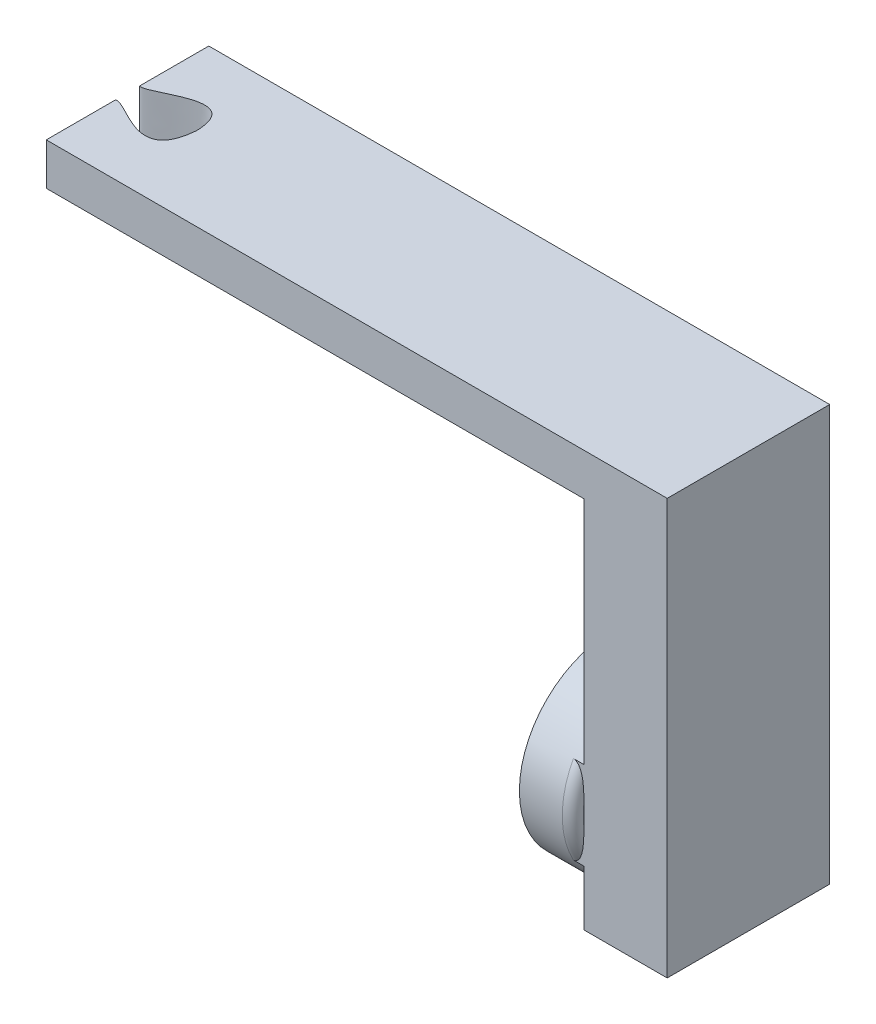
ISO-10303-21;
HEADER;
FILE_DESCRIPTION(('STEP AP214'),'2;1');
FILE_NAME('part.step','',(''),(''),'','','');
FILE_SCHEMA(('AUTOMOTIVE_DESIGN { 1 0 10303 214 1 1 1 1 }'));
ENDSEC;
DATA;
#1=APPLICATION_CONTEXT('core data for automotive mechanical design processes');
#2=APPLICATION_PROTOCOL_DEFINITION('international standard','automotive_design',2000,#1);
#3=PRODUCT_CONTEXT('',#1,'mechanical');
#4=PRODUCT('Part','Part','',(#3));
#5=PRODUCT_RELATED_PRODUCT_CATEGORY('part','',(#4));
#6=PRODUCT_DEFINITION_FORMATION('','',#4);
#7=PRODUCT_DEFINITION_CONTEXT('part definition',#1,'design');
#8=PRODUCT_DEFINITION('design','',#6,#7);
#9=PRODUCT_DEFINITION_SHAPE('','',#8);
#10=(LENGTH_UNIT() NAMED_UNIT(*) SI_UNIT(.MILLI.,.METRE.));
#11=(NAMED_UNIT(*) PLANE_ANGLE_UNIT() SI_UNIT($,.RADIAN.));
#12=(NAMED_UNIT(*) SI_UNIT($,.STERADIAN.) SOLID_ANGLE_UNIT());
#13=UNCERTAINTY_MEASURE_WITH_UNIT(LENGTH_MEASURE(1.E-05),#10,'distance_accuracy_value','');
#14=(GEOMETRIC_REPRESENTATION_CONTEXT(3) GLOBAL_UNCERTAINTY_ASSIGNED_CONTEXT((#13)) GLOBAL_UNIT_ASSIGNED_CONTEXT((#10,
#11,#12)) REPRESENTATION_CONTEXT('',''));
#15=CARTESIAN_POINT('',(0.,0.,0.));
#16=DIRECTION('',(0.,0.,1.));
#17=DIRECTION('',(1.,0.,0.));
#18=AXIS2_PLACEMENT_3D('',#15,#16,#17);
#19=CARTESIAN_POINT('',(127.99867768057,-88.9,-38.6949708390272));
#20=DIRECTION('',(1.,0.,0.));
#21=DIRECTION('',(0.,0.,-1.));
#22=AXIS2_PLACEMENT_3D('',#19,#20,#21);
#23=PLANE('',#22);
#24=CARTESIAN_POINT('',(127.99867768057,-65.278,-19.3474854195136));
#25=DIRECTION('',(1.,0.,0.));
#26=DIRECTION('',(0.,0.,-1.));
#27=AXIS2_PLACEMENT_3D('',#24,#25,#26);
#28=CIRCLE('',#27,22.);
#29=CARTESIAN_POINT('',(127.99867768057,-75.7505740838491,-38.6949708390272));
#30=VERTEX_POINT('',#29);
#31=CARTESIAN_POINT('',(127.99867768057,-75.7505740838491,0.));
#32=VERTEX_POINT('',#31);
#33=EDGE_CURVE('E270',#30,#32,#28,.F.);
#34=ORIENTED_EDGE('',*,*,#33,.F.);
#35=DIRECTION('',(0.,1.,0.));
#36=VECTOR('',#35,1.);
#37=CARTESIAN_POINT('',(127.99867768057,-88.9,-38.6949708390272));
#38=LINE('',#37,#36);
#39=CARTESIAN_POINT('',(127.99867768057,-88.9,-38.6949708390272));
#40=VERTEX_POINT('',#39);
#41=EDGE_CURVE('E180',#40,#30,#38,.T.);
#42=ORIENTED_EDGE('',*,*,#41,.F.);
#43=DIRECTION('',(0.,0.,-1.));
#44=VECTOR('',#43,1.);
#45=CARTESIAN_POINT('',(127.99867768057,-88.9,-38.6949708390272));
#46=LINE('',#45,#44);
#47=CARTESIAN_POINT('',(127.99867768057,-88.9,0.));
#48=VERTEX_POINT('',#47);
#49=EDGE_CURVE('E162',#48,#40,#46,.T.);
#50=ORIENTED_EDGE('',*,*,#49,.F.);
#51=DIRECTION('',(0.,1.,0.));
#52=VECTOR('',#51,1.);
#53=CARTESIAN_POINT('',(127.99867768057,-88.9,0.));
#54=LINE('',#53,#52);
#55=EDGE_CURVE('E159',#48,#32,#54,.T.);
#56=ORIENTED_EDGE('',*,*,#55,.T.);
#57=EDGE_LOOP('',(#34,#42,#50,#56));
#58=FACE_BOUND('',#57,.T.);
#59=ADVANCED_FACE('F33',(#58),#23,.F.);
#60=CARTESIAN_POINT('',(8.4450207177178,0.,-13.0600594295657));
#61=DIRECTION('',(0.,1.,0.));
#62=DIRECTION('',(0.,0.,1.));
#63=AXIS2_PLACEMENT_3D('',#60,#61,#62);
#64=PLANE('',#63);
#65=DIRECTION('',(0.,0.,-1.));
#66=VECTOR('',#65,1.);
#67=CARTESIAN_POINT('',(127.99867768057,0.,-38.6949708390272));
#68=LINE('',#67,#66);
#69=CARTESIAN_POINT('',(127.99867768057,0.,0.));
#70=VERTEX_POINT('',#69);
#71=CARTESIAN_POINT('',(127.99867768057,0.,-38.6949708390272));
#72=VERTEX_POINT('',#71);
#73=EDGE_CURVE('E168',#70,#72,#68,.T.);
#74=ORIENTED_EDGE('',*,*,#73,.F.);
#75=DIRECTION('',(1.,0.,0.));
#76=VECTOR('',#75,1.);
#77=CARTESIAN_POINT('',(0.,0.,0.));
#78=LINE('',#77,#76);
#79=CARTESIAN_POINT('',(0.,0.,0.));
#80=VERTEX_POINT('',#79);
#81=EDGE_CURVE('E385',#80,#70,#78,.T.);
#82=ORIENTED_EDGE('',*,*,#81,.F.);
#83=DIRECTION('',(0.,0.,1.));
#84=VECTOR('',#83,1.);
#85=CARTESIAN_POINT('',(0.,0.,0.));
#86=LINE('',#85,#84);
#87=CARTESIAN_POINT('',(0.,0.,-16.5121344341374));
#88=VERTEX_POINT('',#87);
#89=EDGE_CURVE('E186',#88,#80,#86,.T.);
#90=ORIENTED_EDGE('',*,*,#89,.F.);
#91=CARTESIAN_POINT('',(15.9956701151346,0.,-19.7112346821213));
#92=CARTESIAN_POINT('',(14.8015757870651,0.,-5.45231285430226));
#93=CARTESIAN_POINT('',(2.38658942180415,0.,-17.3000559191201));
#94=CARTESIAN_POINT('',(0.,0.,-16.5121344341374));
#95=B_SPLINE_CURVE_WITH_KNOTS('',3,(#91,#92,#93,#94),.UNSPECIFIED.,.F.,.F.,(4,4),(0.,1.),.UNSPECIFIED.);
#96=CARTESIAN_POINT('',(15.9956701151346,0.,-19.7112346821211));
#97=VERTEX_POINT('',#96);
#98=EDGE_CURVE('E192',#97,#88,#95,.T.);
#99=ORIENTED_EDGE('',*,*,#98,.F.);
#100=CARTESIAN_POINT('',(0.,0.,-22.1828364048899));
#101=CARTESIAN_POINT('',(2.80590377124711,0.,-21.4591789106064));
#102=CARTESIAN_POINT('',(15.7773313591399,0.,-32.7734693197357));
#103=CARTESIAN_POINT('',(15.9956701151346,0.,-19.7112346821211));
#104=B_SPLINE_CURVE_WITH_KNOTS('',3,(#100,#101,#102,#103),.UNSPECIFIED.,.F.,.F.,(4,4),(0.,1.),.UNSPECIFIED.);
#105=CARTESIAN_POINT('',(0.,0.,-22.1828364048899));
#106=VERTEX_POINT('',#105);
#107=EDGE_CURVE('E371',#106,#97,#104,.T.);
#108=ORIENTED_EDGE('',*,*,#107,.F.);
#109=DIRECTION('',(0.,0.,1.));
#110=VECTOR('',#109,1.);
#111=CARTESIAN_POINT('',(0.,0.,-22.1828364048899));
#112=LINE('',#111,#110);
#113=CARTESIAN_POINT('',(0.,0.,-38.6949708390272));
#114=VERTEX_POINT('',#113);
#115=EDGE_CURVE('E378',#114,#106,#112,.T.);
#116=ORIENTED_EDGE('',*,*,#115,.F.);
#117=DIRECTION('',(-1.,0.,0.));
#118=VECTOR('',#117,1.);
#119=CARTESIAN_POINT('',(0.,0.,-38.6949708390272));
#120=LINE('',#119,#118);
#121=EDGE_CURVE('E383',#72,#114,#120,.T.);
#122=ORIENTED_EDGE('',*,*,#121,.F.);
#123=EDGE_LOOP('',(#74,#82,#90,#99,#108,#116,#122));
#124=FACE_BOUND('',#123,.T.);
#125=ADVANCED_FACE('F252',(#124),#64,.F.);
#126=CARTESIAN_POINT('',(0.,10.,0.));
#127=DIRECTION('',(1.,0.,0.));
#128=DIRECTION('',(0.,0.,-1.));
#129=AXIS2_PLACEMENT_3D('',#126,#127,#128);
#130=PLANE('',#129);
#131=ORIENTED_EDGE('',*,*,#89,.T.);
#132=DIRECTION('',(0.,-1.,0.));
#133=VECTOR('',#132,1.);
#134=CARTESIAN_POINT('',(0.,10.,0.));
#135=LINE('',#134,#133);
#136=CARTESIAN_POINT('',(0.,10.,0.));
#137=VERTEX_POINT('',#136);
#138=EDGE_CURVE('E152',#137,#80,#135,.T.);
#139=ORIENTED_EDGE('',*,*,#138,.F.);
#140=DIRECTION('',(0.,0.,1.));
#141=VECTOR('',#140,1.);
#142=CARTESIAN_POINT('',(0.,10.,0.));
#143=LINE('',#142,#141);
#144=CARTESIAN_POINT('',(0.,10.,-16.5121344341374));
#145=VERTEX_POINT('',#144);
#146=EDGE_CURVE('E188',#145,#137,#143,.T.);
#147=ORIENTED_EDGE('',*,*,#146,.F.);
#148=DIRECTION('',(0.,-1.,0.));
#149=VECTOR('',#148,1.);
#150=CARTESIAN_POINT('',(0.,10.,-16.5121344341374));
#151=LINE('',#150,#149);
#152=EDGE_CURVE('E366',#145,#88,#151,.T.);
#153=ORIENTED_EDGE('',*,*,#152,.T.);
#154=EDGE_LOOP('',(#131,#139,#147,#153));
#155=FACE_BOUND('',#154,.T.);
#156=ADVANCED_FACE('F249',(#155),#130,.F.);
#157=CARTESIAN_POINT('',(0.,10.,0.));
#158=DIRECTION('',(0.,0.,-1.));
#159=DIRECTION('',(-1.,0.,0.));
#160=AXIS2_PLACEMENT_3D('',#157,#158,#159);
#161=PLANE('',#160);
#162=ORIENTED_EDGE('',*,*,#81,.T.);
#163=CARTESIAN_POINT('',(127.99867768057,-54.8054259161509,0.));
#164=VERTEX_POINT('',#163);
#165=EDGE_CURVE('E183',#164,#70,#54,.T.);
#166=ORIENTED_EDGE('',*,*,#165,.F.);
#167=DIRECTION('',(1.,0.,0.));
#168=VECTOR('',#167,1.);
#169=CARTESIAN_POINT('',(125.49867768057,-54.8054259161509,0.));
#170=LINE('',#169,#168);
#171=CARTESIAN_POINT('',(125.49867768057,-54.8054259161509,0.));
#172=VERTEX_POINT('',#171);
#173=EDGE_CURVE('E263',#172,#164,#170,.T.);
#174=ORIENTED_EDGE('',*,*,#173,.F.);
#175=CARTESIAN_POINT('',(125.49867768057,-54.8054259161509,0.));
#176=CARTESIAN_POINT('',(125.534549779496,-54.805417877973,0.));
#177=CARTESIAN_POINT('',(125.570401633384,-54.8070492314033,0.));
#178=CARTESIAN_POINT('',(125.641787403858,-54.8135043997957,0.));
#179=CARTESIAN_POINT('',(125.677321561618,-54.8183255393157,0.));
#180=CARTESIAN_POINT('',(125.782447175556,-54.8373265359022,0.));
#181=CARTESIAN_POINT('',(125.851257313316,-54.8560476326537,0.));
#182=CARTESIAN_POINT('',(125.984750554884,-54.9040220293344,0.));
#183=CARTESIAN_POINT('',(126.049445539526,-54.9332432228338,0.));
#184=CARTESIAN_POINT('',(126.174274575371,-55.0003818894811,0.));
#185=CARTESIAN_POINT('',(126.234397250177,-55.0383201663807,0.));
#186=CARTESIAN_POINT('',(126.389855710778,-55.14987851257,0.));
#187=CARTESIAN_POINT('',(126.480552230527,-55.2299469980976,0.));
#188=CARTESIAN_POINT('',(126.648640480711,-55.4029754206652,0.));
#189=CARTESIAN_POINT('',(126.72599442004,-55.4959706698341,0.));
#190=CARTESIAN_POINT('',(126.86114799803,-55.6795819043724,0.));
#191=CARTESIAN_POINT('',(126.920164798004,-55.7693183936313,0.));
#192=CARTESIAN_POINT('',(127.030322147936,-55.9535492774397,0.));
#193=CARTESIAN_POINT('',(127.08145602131,-56.0480476162238,0.));
#194=CARTESIAN_POINT('',(127.176976090986,-56.2405561459892,0.));
#195=CARTESIAN_POINT('',(127.221350853611,-56.3385719485866,0.));
#196=CARTESIAN_POINT('',(127.304163460054,-56.5370145987542,0.));
#197=CARTESIAN_POINT('',(127.342603375989,-56.6374405906059,0.));
#198=CARTESIAN_POINT('',(127.429988363095,-56.8842638253805,0.));
#199=CARTESIAN_POINT('',(127.476211071507,-57.0316223833252,0.));
#200=CARTESIAN_POINT('',(127.55995089425,-57.3288213299456,0.));
#201=CARTESIAN_POINT('',(127.597463626619,-57.4786629273936,0.));
#202=CARTESIAN_POINT('',(127.665277661257,-57.7802208812449,0.));
#203=CARTESIAN_POINT('',(127.695566439824,-57.9319400206206,0.));
#204=CARTESIAN_POINT('',(127.750043276998,-58.236482227046,0.));
#205=CARTESIAN_POINT('',(127.774230201472,-58.3893054938947,0.));
#206=CARTESIAN_POINT('',(127.817620827183,-58.6966557330493,0.));
#207=CARTESIAN_POINT('',(127.836791306427,-58.8511873326564,0.));
#208=CARTESIAN_POINT('',(127.870783919317,-59.1607329632442,0.));
#209=CARTESIAN_POINT('',(127.88560566876,-59.3157470356285,0.));
#210=CARTESIAN_POINT('',(127.92463283494,-59.7809176327666,0.));
#211=CARTESIAN_POINT('',(127.943442454068,-60.0915256191005,0.));
#212=CARTESIAN_POINT('',(127.966607408522,-60.607061966472,0.));
#213=CARTESIAN_POINT('',(127.97370477095,-60.8118884772178,0.));
#214=CARTESIAN_POINT('',(127.984763776684,-61.2216605507734,0.));
#215=CARTESIAN_POINT('',(127.988724918896,-61.4266061273742,0.));
#216=CARTESIAN_POINT('',(127.994415776785,-61.8336338423682,0.));
#217=CARTESIAN_POINT('',(127.996176155567,-62.0357156271891,0.));
#218=CARTESIAN_POINT('',(127.998295433189,-62.439835358555,0.));
#219=CARTESIAN_POINT('',(127.998654692729,-62.6418733029918,0.));
#220=CARTESIAN_POINT('',(127.99867768057,-62.8439071624714,0.));
#221=B_SPLINE_CURVE_WITH_KNOTS('',3,(#175,#176,#177,#178,#179,#180,#181,#182,#183,#184,#185,
#186,#187,#188,#189,#190,#191,#192,#193,#194,#195,#196,#197,#198,#199,#200,#201,#202,#203,#204,
#205,#206,#207,#208,#209,#210,#211,#212,#213,#214,#215,#216,#217,#218,#219,#220),.UNSPECIFIED.,
.F.,.F.,(4,2,2,2,2,2,2,2,2,2,2,2,2,2,2,2,2,2,2,2,2,2,4),(0.,0.107541316419669,0.214992546409573,
0.427837884615498,0.640037862036771,0.852749624299243,1.21361053522845,1.57547732716521,
1.89722051824507,2.21923473570236,2.54178776169803,2.86422791420227,3.32718660942116,
3.79037771550433,4.2543660822567,4.71844062568869,5.18551493179386,5.65263049059046,
6.58588519246199,7.20071732555021,7.81564767460551,8.42191112999402,9.02801850043509),.UNSPECIFIED.);
#222=CARTESIAN_POINT('',(127.99867768057,-62.8439071624714,0.));
#223=VERTEX_POINT('',#222);
#224=EDGE_CURVE('E46',#172,#223,#221,.T.);
#225=ORIENTED_EDGE('',*,*,#224,.T.);
#226=CARTESIAN_POINT('',(127.99867768057,-67.7120928375286,0.));
#227=VERTEX_POINT('',#226);
#228=EDGE_CURVE('E187',#227,#223,#54,.T.);
#229=ORIENTED_EDGE('',*,*,#228,.F.);
#230=CARTESIAN_POINT('',(127.99867768057,-67.7120928375286,0.));
#231=CARTESIAN_POINT('',(127.998651209059,-67.9204313789086,0.));
#232=CARTESIAN_POINT('',(127.998270920503,-68.1287756371866,0.));
#233=CARTESIAN_POINT('',(127.99599711209,-68.5454923464312,0.));
#234=CARTESIAN_POINT('',(127.994103320431,-68.7538647957396,0.));
#235=CARTESIAN_POINT('',(127.987979406295,-69.1717352235252,0.));
#236=CARTESIAN_POINT('',(127.983736386025,-69.3812330356817,0.));
#237=CARTESIAN_POINT('',(127.971888608942,-69.8001252337407,0.));
#238=CARTESIAN_POINT('',(127.964284078401,-70.009519625655,0.));
#239=CARTESIAN_POINT('',(127.944530532892,-70.4280849409009,0.));
#240=CARTESIAN_POINT('',(127.932381907284,-70.6372558818393,0.));
#241=CARTESIAN_POINT('',(127.902141163441,-71.0551640609575,0.));
#242=CARTESIAN_POINT('',(127.884049599969,-71.2639013377895,0.));
#243=CARTESIAN_POINT('',(127.840292928322,-71.6801385686226,0.));
#244=CARTESIAN_POINT('',(127.814644404318,-71.8876402274651,0.));
#245=CARTESIAN_POINT('',(127.753729539051,-72.3012041824015,0.));
#246=CARTESIAN_POINT('',(127.718466774854,-72.5072669846485,0.));
#247=CARTESIAN_POINT('',(127.658097441181,-72.806164890727,0.));
#248=CARTESIAN_POINT('',(127.637809324532,-72.8999760261753,0.));
#249=CARTESIAN_POINT('',(127.59433671634,-73.0869351103727,0.));
#250=CARTESIAN_POINT('',(127.571151771753,-73.1800829529731,0.));
#251=CARTESIAN_POINT('',(127.496494833577,-73.4592299460506,0.));
#252=CARTESIAN_POINT('',(127.440105145168,-73.6439823145834,0.));
#253=CARTESIAN_POINT('',(127.332340932119,-73.9469669071459,0.));
#254=CARTESIAN_POINT('',(127.285566478334,-74.0668335638973,0.));
#255=CARTESIAN_POINT('',(127.183226795521,-74.3029377002968,0.));
#256=CARTESIAN_POINT('',(127.127654273101,-74.4191720722898,0.));
#257=CARTESIAN_POINT('',(127.006522423905,-74.6452773557503,0.));
#258=CARTESIAN_POINT('',(126.941040376585,-74.7551891351495,0.));
#259=CARTESIAN_POINT('',(126.797886835702,-74.966645332729,0.));
#260=CARTESIAN_POINT('',(126.720243490582,-75.0682082672715,0.));
#261=CARTESIAN_POINT('',(126.576086711213,-75.2299427159124,0.));
#262=CARTESIAN_POINT('',(126.513255697102,-75.2933724760663,0.));
#263=CARTESIAN_POINT('',(126.379818914664,-75.4117515901152,0.));
#264=CARTESIAN_POINT('',(126.30920652231,-75.4666936216391,0.));
#265=CARTESIAN_POINT('',(126.159138368199,-75.56553149608,0.));
#266=CARTESIAN_POINT('',(126.079578163253,-75.6092719307558,0.));
#267=CARTESIAN_POINT('',(125.913616628971,-75.6806143507461,0.));
#268=CARTESIAN_POINT('',(125.827244118599,-75.7082805731216,0.));
#269=CARTESIAN_POINT('',(125.699507763388,-75.7342636614574,0.));
#270=CARTESIAN_POINT('',(125.659639053034,-75.7403508400199,0.));
#271=CARTESIAN_POINT('',(125.579417543355,-75.7485150386798,0.));
#272=CARTESIAN_POINT('',(125.539063963836,-75.7505843646454,0.));
#273=CARTESIAN_POINT('',(125.49867768057,-75.7505740838491,0.));
#274=B_SPLINE_CURVE_WITH_KNOTS('',3,(#230,#231,#232,#233,#234,#235,#236,#237,#238,#239,#240,
#241,#242,#243,#244,#245,#246,#247,#248,#249,#250,#251,#252,#253,#254,#255,#256,#257,#258,#259,
#260,#261,#262,#263,#264,#265,#266,#267,#268,#269,#270,#271,#272,#273),.UNSPECIFIED.,.F.,.F.,(4,
2,2,2,2,2,2,2,2,2,2,2,2,2,2,2,2,2,2,2,2,4),(0.,0.625024348670401,1.25016096794978,
1.87876425828468,2.50732524213566,3.13583238015589,3.76428086479374,4.39136032830842,
5.01820679886956,5.30610373031974,5.59404574345396,6.17282879206291,6.55857278058044,
6.94463823250796,7.32783487446257,7.7101573339032,7.97742265220368,8.24491726820648,
8.51594335794394,8.78587876639953,8.90669266793515,9.02773769911569),.UNSPECIFIED.);
#275=CARTESIAN_POINT('',(125.49867768057,-75.7505740838491,0.));
#276=VERTEX_POINT('',#275);
#277=EDGE_CURVE('E11',#227,#276,#274,.T.);
#278=ORIENTED_EDGE('',*,*,#277,.T.);
#279=DIRECTION('',(1.,0.,0.));
#280=VECTOR('',#279,1.);
#281=CARTESIAN_POINT('',(127.99867768057,-75.7505740838491,0.));
#282=LINE('',#281,#280);
#283=EDGE_CURVE('E52',#32,#276,#282,.F.);
#284=ORIENTED_EDGE('',*,*,#283,.F.);
#285=ORIENTED_EDGE('',*,*,#55,.F.);
#286=DIRECTION('',(-1.,0.,0.));
#287=VECTOR('',#286,1.);
#288=CARTESIAN_POINT('',(147.830868252527,-88.9,0.));
#289=LINE('',#288,#287);
#290=CARTESIAN_POINT('',(147.830868252527,-88.9,0.));
#291=VERTEX_POINT('',#290);
#292=EDGE_CURVE('E155',#291,#48,#289,.T.);
#293=ORIENTED_EDGE('',*,*,#292,.F.);
#294=DIRECTION('',(0.,-1.,0.));
#295=VECTOR('',#294,1.);
#296=CARTESIAN_POINT('',(147.830868252527,10.,0.));
#297=LINE('',#296,#295);
#298=CARTESIAN_POINT('',(147.830868252527,10.,0.));
#299=VERTEX_POINT('',#298);
#300=EDGE_CURVE('E145',#299,#291,#297,.T.);
#301=ORIENTED_EDGE('',*,*,#300,.F.);
#302=DIRECTION('',(1.,0.,0.));
#303=VECTOR('',#302,1.);
#304=CARTESIAN_POINT('',(0.,10.,0.));
#305=LINE('',#304,#303);
#306=EDGE_CURVE('E191',#137,#299,#305,.T.);
#307=ORIENTED_EDGE('',*,*,#306,.F.);
#308=ORIENTED_EDGE('',*,*,#138,.T.);
#309=EDGE_LOOP('',(#162,#166,#174,#225,#229,#278,#284,#285,#293,#301,#307,#308));
#310=FACE_BOUND('',#309,.T.);
#311=ADVANCED_FACE('F157',(#310),#161,.F.);
#312=CARTESIAN_POINT('',(147.830868252527,10.,0.));
#313=DIRECTION('',(-1.,0.,0.));
#314=DIRECTION('',(0.,0.,1.));
#315=AXIS2_PLACEMENT_3D('',#312,#313,#314);
#316=PLANE('',#315);
#317=ORIENTED_EDGE('',*,*,#300,.T.);
#318=DIRECTION('',(0.,0.,1.));
#319=VECTOR('',#318,1.);
#320=CARTESIAN_POINT('',(147.830868252527,-88.9,-38.6949708390272));
#321=LINE('',#320,#319);
#322=CARTESIAN_POINT('',(147.830868252527,-88.9,-38.6949708390272));
#323=VERTEX_POINT('',#322);
#324=EDGE_CURVE('E150',#323,#291,#321,.T.);
#325=ORIENTED_EDGE('',*,*,#324,.F.);
#326=DIRECTION('',(0.,-1.,0.));
#327=VECTOR('',#326,1.);
#328=CARTESIAN_POINT('',(147.830868252527,10.,-38.6949708390272));
#329=LINE('',#328,#327);
#330=CARTESIAN_POINT('',(147.830868252527,10.,-38.6949708390272));
#331=VERTEX_POINT('',#330);
#332=EDGE_CURVE('E153',#331,#323,#329,.T.);
#333=ORIENTED_EDGE('',*,*,#332,.F.);
#334=DIRECTION('',(0.,0.,-1.));
#335=VECTOR('',#334,1.);
#336=CARTESIAN_POINT('',(147.830868252527,10.,0.));
#337=LINE('',#336,#335);
#338=EDGE_CURVE('E151',#299,#331,#337,.T.);
#339=ORIENTED_EDGE('',*,*,#338,.F.);
#340=EDGE_LOOP('',(#317,#325,#333,#339));
#341=FACE_BOUND('',#340,.T.);
#342=ADVANCED_FACE('F147',(#341),#316,.F.);
#343=CARTESIAN_POINT('',(0.,10.,-38.6949708390272));
#344=DIRECTION('',(0.,0.,1.));
#345=DIRECTION('',(1.,0.,0.));
#346=AXIS2_PLACEMENT_3D('',#343,#344,#345);
#347=PLANE('',#346);
#348=ORIENTED_EDGE('',*,*,#332,.T.);
#349=DIRECTION('',(1.,0.,0.));
#350=VECTOR('',#349,1.);
#351=CARTESIAN_POINT('',(147.830868252527,-88.9,-38.6949708390272));
#352=LINE('',#351,#350);
#353=EDGE_CURVE('E167',#40,#323,#352,.T.);
#354=ORIENTED_EDGE('',*,*,#353,.F.);
#355=ORIENTED_EDGE('',*,*,#41,.T.);
#356=DIRECTION('',(1.,0.,0.));
#357=VECTOR('',#356,1.);
#358=CARTESIAN_POINT('',(125.49867768057,-75.7505740838491,-38.6949708390272));
#359=LINE('',#358,#357);
#360=CARTESIAN_POINT('',(125.49867768057,-75.7505740838491,-38.6949708390272));
#361=VERTEX_POINT('',#360);
#362=EDGE_CURVE('E343',#361,#30,#359,.T.);
#363=ORIENTED_EDGE('',*,*,#362,.F.);
#364=CARTESIAN_POINT('',(125.49867768057,-75.7505740838491,-38.6949708390272));
#365=CARTESIAN_POINT('',(125.534549779496,-75.750582122027,-38.6949708390272));
#366=CARTESIAN_POINT('',(125.570401633384,-75.7489507685967,-38.6949708390272));
#367=CARTESIAN_POINT('',(125.641787403858,-75.7424956002043,-38.6949708390272));
#368=CARTESIAN_POINT('',(125.677321561618,-75.7376744606843,-38.6949708390272));
#369=CARTESIAN_POINT('',(125.782447175556,-75.7186734640978,-38.6949708390272));
#370=CARTESIAN_POINT('',(125.851257313316,-75.6999523673463,-38.6949708390272));
#371=CARTESIAN_POINT('',(125.984750554884,-75.6519779706656,-38.6949708390272));
#372=CARTESIAN_POINT('',(126.049445539526,-75.6227567771662,-38.6949708390272));
#373=CARTESIAN_POINT('',(126.174274575371,-75.5556181105189,-38.6949708390272));
#374=CARTESIAN_POINT('',(126.234397250177,-75.5176798336192,-38.6949708390272));
#375=CARTESIAN_POINT('',(126.389855710778,-75.40612148743,-38.6949708390272));
#376=CARTESIAN_POINT('',(126.480552230527,-75.3260530019024,-38.6949708390272));
#377=CARTESIAN_POINT('',(126.648640480711,-75.1530245793347,-38.6949708390272));
#378=CARTESIAN_POINT('',(126.72599442004,-75.0600293301659,-38.6949708390272));
#379=CARTESIAN_POINT('',(126.86114799803,-74.8764180956275,-38.6949708390272));
#380=CARTESIAN_POINT('',(126.920164798004,-74.7866816063686,-38.6949708390272));
#381=CARTESIAN_POINT('',(127.030322147936,-74.6024507225602,-38.6949708390272));
#382=CARTESIAN_POINT('',(127.08145602131,-74.5079523837762,-38.6949708390272));
#383=CARTESIAN_POINT('',(127.176976090986,-74.3154438540108,-38.6949708390272));
#384=CARTESIAN_POINT('',(127.221350853611,-74.2174280514134,-38.6949708390272));
#385=CARTESIAN_POINT('',(127.304163460054,-74.0189854012458,-38.6949708390272));
#386=CARTESIAN_POINT('',(127.342603375989,-73.918559409394,-38.6949708390272));
#387=CARTESIAN_POINT('',(127.429988363095,-73.6717361746194,-38.6949708390272));
#388=CARTESIAN_POINT('',(127.476211071507,-73.5243776166747,-38.6949708390272));
#389=CARTESIAN_POINT('',(127.55995089425,-73.2271786700544,-38.6949708390272));
#390=CARTESIAN_POINT('',(127.597463626619,-73.0773370726064,-38.6949708390272));
#391=CARTESIAN_POINT('',(127.665277661257,-72.775779118755,-38.6949708390272));
#392=CARTESIAN_POINT('',(127.695566439824,-72.6240599793793,-38.6949708390272));
#393=CARTESIAN_POINT('',(127.750043276998,-72.319517772954,-38.6949708390272));
#394=CARTESIAN_POINT('',(127.774230201472,-72.1666945061052,-38.6949708390272));
#395=CARTESIAN_POINT('',(127.817620827183,-71.8593442669506,-38.6949708390272));
#396=CARTESIAN_POINT('',(127.836791306427,-71.7048126673435,-38.6949708390272));
#397=CARTESIAN_POINT('',(127.870783919317,-71.3952670367557,-38.6949708390272));
#398=CARTESIAN_POINT('',(127.88560566876,-71.2402529643714,-38.6949708390272));
#399=CARTESIAN_POINT('',(127.92463283494,-70.7750823672333,-38.6949708390272));
#400=CARTESIAN_POINT('',(127.943442454068,-70.4644743808994,-38.6949708390272));
#401=CARTESIAN_POINT('',(127.966607408522,-69.9489380335278,-38.6949708390272));
#402=CARTESIAN_POINT('',(127.97370477095,-69.744111522782,-38.6949708390272));
#403=CARTESIAN_POINT('',(127.984763776684,-69.3343394492265,-38.6949708390272));
#404=CARTESIAN_POINT('',(127.988724918896,-69.1293938726257,-38.6949708390272));
#405=CARTESIAN_POINT('',(127.994415776785,-68.7223661576318,-38.6949708390272));
#406=CARTESIAN_POINT('',(127.996176155567,-68.5202843728108,-38.6949708390272));
#407=CARTESIAN_POINT('',(127.998295433189,-68.1161646414449,-38.6949708390272));
#408=CARTESIAN_POINT('',(127.998654692729,-67.9141266970082,-38.6949708390272));
#409=CARTESIAN_POINT('',(127.99867768057,-67.7120928375286,-38.6949708390272));
#410=B_SPLINE_CURVE_WITH_KNOTS('',3,(#364,#365,#366,#367,#368,#369,#370,#371,#372,#373,#374,
#375,#376,#377,#378,#379,#380,#381,#382,#383,#384,#385,#386,#387,#388,#389,#390,#391,#392,#393,
#394,#395,#396,#397,#398,#399,#400,#401,#402,#403,#404,#405,#406,#407,#408,#409),.UNSPECIFIED.,
.F.,.F.,(4,2,2,2,2,2,2,2,2,2,2,2,2,2,2,2,2,2,2,2,2,2,4),(0.,0.107541316419669,0.214992546409544,
0.427837884615496,0.640037862036771,0.852749624299247,1.21361053522845,1.57547732716521,
1.89722051824507,2.21923473570239,2.54178776169806,2.86422791420229,3.32718660942119,
3.79037771550438,4.25436608225676,4.71844062568878,5.18551493179395,5.65263049059058,
6.58588519246215,7.20071732555033,7.81564767460557,8.42191112999403,9.02801850043509),.UNSPECIFIED.);
#411=CARTESIAN_POINT('',(127.99867768057,-67.7120928375286,-38.6949708390272));
#412=VERTEX_POINT('',#411);
#413=EDGE_CURVE('E231',#361,#412,#410,.T.);
#414=ORIENTED_EDGE('',*,*,#413,.T.);
#415=CARTESIAN_POINT('',(127.99867768057,-62.8439071624714,-38.6949708390272));
#416=VERTEX_POINT('',#415);
#417=EDGE_CURVE('E184',#412,#416,#38,.T.);
#418=ORIENTED_EDGE('',*,*,#417,.T.);
#419=CARTESIAN_POINT('',(127.99867768057,-62.8439071624714,-38.6949708390272));
#420=CARTESIAN_POINT('',(127.998651209059,-62.6355686210914,-38.6949708390272));
#421=CARTESIAN_POINT('',(127.998270920503,-62.4272243628134,-38.6949708390272));
#422=CARTESIAN_POINT('',(127.99599711209,-62.0105076535688,-38.6949708390272));
#423=CARTESIAN_POINT('',(127.994103320431,-61.8021352042604,-38.6949708390272));
#424=CARTESIAN_POINT('',(127.987979406295,-61.3842647764748,-38.6949708390272));
#425=CARTESIAN_POINT('',(127.983736386025,-61.1747669643183,-38.6949708390272));
#426=CARTESIAN_POINT('',(127.971888608942,-60.7558747662593,-38.6949708390272));
#427=CARTESIAN_POINT('',(127.964284078401,-60.546480374345,-38.6949708390272));
#428=CARTESIAN_POINT('',(127.944530532892,-60.1279150590991,-38.6949708390272));
#429=CARTESIAN_POINT('',(127.932381907284,-59.9187441181607,-38.6949708390272));
#430=CARTESIAN_POINT('',(127.902141163441,-59.5008359390425,-38.6949708390272));
#431=CARTESIAN_POINT('',(127.884049599969,-59.2920986622105,-38.6949708390272));
#432=CARTESIAN_POINT('',(127.840292928322,-58.8758614313773,-38.6949708390272));
#433=CARTESIAN_POINT('',(127.814644404318,-58.6683597725349,-38.6949708390272));
#434=CARTESIAN_POINT('',(127.753729539051,-58.2547958175984,-38.6949708390272));
#435=CARTESIAN_POINT('',(127.718466774854,-58.0487330153514,-38.6949708390272));
#436=CARTESIAN_POINT('',(127.658097441181,-57.749835109273,-38.6949708390272));
#437=CARTESIAN_POINT('',(127.637809324532,-57.6560239738247,-38.6949708390272));
#438=CARTESIAN_POINT('',(127.59433671634,-57.4690648896274,-38.6949708390272));
#439=CARTESIAN_POINT('',(127.571151771753,-57.3759170470269,-38.6949708390272));
#440=CARTESIAN_POINT('',(127.496494833577,-57.0967700539494,-38.6949708390272));
#441=CARTESIAN_POINT('',(127.440105145168,-56.9120176854166,-38.6949708390272));
#442=CARTESIAN_POINT('',(127.332340932119,-56.6090330928541,-38.6949708390272));
#443=CARTESIAN_POINT('',(127.285566478334,-56.4891664361027,-38.6949708390272));
#444=CARTESIAN_POINT('',(127.183226795521,-56.2530622997032,-38.6949708390272));
#445=CARTESIAN_POINT('',(127.127654273101,-56.1368279277102,-38.6949708390272));
#446=CARTESIAN_POINT('',(127.006522423905,-55.9107226442497,-38.6949708390272));
#447=CARTESIAN_POINT('',(126.941040376585,-55.8008108648504,-38.6949708390272));
#448=CARTESIAN_POINT('',(126.797886835702,-55.5893546672709,-38.6949708390272));
#449=CARTESIAN_POINT('',(126.720243490582,-55.4877917327285,-38.6949708390272));
#450=CARTESIAN_POINT('',(126.576086711213,-55.3260572840876,-38.6949708390272));
#451=CARTESIAN_POINT('',(126.513255697102,-55.2626275239336,-38.6949708390272));
#452=CARTESIAN_POINT('',(126.379818914664,-55.1442484098848,-38.6949708390272));
#453=CARTESIAN_POINT('',(126.30920652231,-55.0893063783608,-38.6949708390272));
#454=CARTESIAN_POINT('',(126.159138368199,-54.9904685039199,-38.6949708390272));
#455=CARTESIAN_POINT('',(126.079578163253,-54.9467280692442,-38.6949708390272));
#456=CARTESIAN_POINT('',(125.913616628971,-54.8753856492539,-38.6949708390272));
#457=CARTESIAN_POINT('',(125.827244118599,-54.8477194268784,-38.6949708390272));
#458=CARTESIAN_POINT('',(125.699507763388,-54.8217363385426,-38.6949708390272));
#459=CARTESIAN_POINT('',(125.659639053034,-54.8156491599801,-38.6949708390272));
#460=CARTESIAN_POINT('',(125.579417543355,-54.8074849613201,-38.6949708390272));
#461=CARTESIAN_POINT('',(125.539063963836,-54.8054156353546,-38.6949708390272));
#462=CARTESIAN_POINT('',(125.49867768057,-54.8054259161509,-38.6949708390272));
#463=B_SPLINE_CURVE_WITH_KNOTS('',3,(#419,#420,#421,#422,#423,#424,#425,#426,#427,#428,#429,
#430,#431,#432,#433,#434,#435,#436,#437,#438,#439,#440,#441,#442,#443,#444,#445,#446,#447,#448,
#449,#450,#451,#452,#453,#454,#455,#456,#457,#458,#459,#460,#461,#462),.UNSPECIFIED.,.F.,.F.,(4,
2,2,2,2,2,2,2,2,2,2,2,2,2,2,2,2,2,2,2,2,4),(0.,0.625024348670387,1.25016096794977,
1.87876425828466,2.50732524213566,3.13583238015587,3.76428086479375,4.39136032830842,
5.01820679886956,5.3061037303197,5.59404574345391,6.17282879206289,6.55857278058043,
6.94463823250795,7.3278348744626,7.71015733390323,7.97742265220368,8.24491726820651,
8.51594335794391,8.78587876639956,8.90669266793517,9.02773769911569),.UNSPECIFIED.);
#464=CARTESIAN_POINT('',(125.49867768057,-54.8054259161509,-38.6949708390272));
#465=VERTEX_POINT('',#464);
#466=EDGE_CURVE('E237',#416,#465,#463,.T.);
#467=ORIENTED_EDGE('',*,*,#466,.T.);
#468=DIRECTION('',(1.,0.,0.));
#469=VECTOR('',#468,1.);
#470=CARTESIAN_POINT('',(127.99867768057,-54.8054259161509,-38.6949708390272));
#471=LINE('',#470,#469);
#472=CARTESIAN_POINT('',(127.99867768057,-54.8054259161509,-38.6949708390272));
#473=VERTEX_POINT('',#472);
#474=EDGE_CURVE('E335',#473,#465,#471,.F.);
#475=ORIENTED_EDGE('',*,*,#474,.F.);
#476=EDGE_CURVE('E178',#473,#72,#38,.T.);
#477=ORIENTED_EDGE('',*,*,#476,.T.);
#478=ORIENTED_EDGE('',*,*,#121,.T.);
#479=DIRECTION('',(0.,-1.,0.));
#480=VECTOR('',#479,1.);
#481=CARTESIAN_POINT('',(0.,10.,-38.6949708390272));
#482=LINE('',#481,#480);
#483=CARTESIAN_POINT('',(0.,10.,-38.6949708390272));
#484=VERTEX_POINT('',#483);
#485=EDGE_CURVE('E356',#484,#114,#482,.T.);
#486=ORIENTED_EDGE('',*,*,#485,.F.);
#487=DIRECTION('',(-1.,0.,0.));
#488=VECTOR('',#487,1.);
#489=CARTESIAN_POINT('',(0.,10.,-38.6949708390272));
#490=LINE('',#489,#488);
#491=EDGE_CURVE('E195',#331,#484,#490,.T.);
#492=ORIENTED_EDGE('',*,*,#491,.F.);
#493=EDGE_LOOP('',(#348,#354,#355,#363,#414,#418,#467,#475,#477,#478,#486,#492));
#494=FACE_BOUND('',#493,.T.);
#495=ADVANCED_FACE('F223',(#494),#347,.F.);
#496=CARTESIAN_POINT('',(0.,10.,-22.1828364048899));
#497=DIRECTION('',(1.,0.,0.));
#498=DIRECTION('',(0.,0.,-1.));
#499=AXIS2_PLACEMENT_3D('',#496,#497,#498);
#500=PLANE('',#499);
#501=ORIENTED_EDGE('',*,*,#115,.T.);
#502=DIRECTION('',(0.,-1.,0.));
#503=VECTOR('',#502,1.);
#504=CARTESIAN_POINT('',(0.,10.,-22.1828364048899));
#505=LINE('',#504,#503);
#506=CARTESIAN_POINT('',(0.,10.,-22.1828364048899));
#507=VERTEX_POINT('',#506);
#508=EDGE_CURVE('E358',#507,#106,#505,.T.);
#509=ORIENTED_EDGE('',*,*,#508,.F.);
#510=DIRECTION('',(0.,0.,1.));
#511=VECTOR('',#510,1.);
#512=CARTESIAN_POINT('',(0.,10.,-22.1828364048899));
#513=LINE('',#512,#511);
#514=EDGE_CURVE('E197',#484,#507,#513,.T.);
#515=ORIENTED_EDGE('',*,*,#514,.F.);
#516=ORIENTED_EDGE('',*,*,#485,.T.);
#517=EDGE_LOOP('',(#501,#509,#515,#516));
#518=FACE_BOUND('',#517,.T.);
#519=ADVANCED_FACE('F218',(#518),#500,.F.);
#520=CARTESIAN_POINT('',(0.,10.,-22.1828364048899));
#521=CARTESIAN_POINT('',(2.80590377124711,10.,-21.4591789106064));
#522=CARTESIAN_POINT('',(15.7773313591399,10.,-32.7734693197357));
#523=CARTESIAN_POINT('',(15.9956701151346,10.,-19.7112346821211));
#524=B_SPLINE_CURVE_WITH_KNOTS('',3,(#520,#521,#522,#523),.UNSPECIFIED.,.F.,.F.,(4,4),(0.,1.),.UNSPECIFIED.);
#525=DIRECTION('',(0.,-1.,0.));
#526=VECTOR('',#525,1.);
#527=SURFACE_OF_LINEAR_EXTRUSION('',#524,#526);
#528=ORIENTED_EDGE('',*,*,#107,.T.);
#529=DIRECTION('',(0.,-1.,0.));
#530=VECTOR('',#529,1.);
#531=CARTESIAN_POINT('',(15.9956701151346,10.,-19.7112346821211));
#532=LINE('',#531,#530);
#533=CARTESIAN_POINT('',(15.9956701151346,10.,-19.7112346821211));
#534=VERTEX_POINT('',#533);
#535=EDGE_CURVE('E363',#534,#97,#532,.T.);
#536=ORIENTED_EDGE('',*,*,#535,.F.);
#537=EDGE_CURVE('E199',#507,#534,#524,.T.);
#538=ORIENTED_EDGE('',*,*,#537,.F.);
#539=ORIENTED_EDGE('',*,*,#508,.T.);
#540=EDGE_LOOP('',(#528,#536,#538,#539));
#541=FACE_BOUND('',#540,.T.);
#542=ADVANCED_FACE('F213',(#541),#527,.F.);
#543=CARTESIAN_POINT('',(15.9956701151346,10.,-19.7112346821213));
#544=CARTESIAN_POINT('',(14.8015757870651,10.,-5.45231285430226));
#545=CARTESIAN_POINT('',(2.38658942180415,10.,-17.3000559191201));
#546=CARTESIAN_POINT('',(0.,10.,-16.5121344341374));
#547=B_SPLINE_CURVE_WITH_KNOTS('',3,(#543,#544,#545,#546),.UNSPECIFIED.,.F.,.F.,(4,4),(0.,1.),.UNSPECIFIED.);
#548=DIRECTION('',(0.,-1.,0.));
#549=VECTOR('',#548,1.);
#550=SURFACE_OF_LINEAR_EXTRUSION('',#547,#549);
#551=ORIENTED_EDGE('',*,*,#98,.T.);
#552=ORIENTED_EDGE('',*,*,#152,.F.);
#553=EDGE_CURVE('E204',#534,#145,#547,.T.);
#554=ORIENTED_EDGE('',*,*,#553,.F.);
#555=ORIENTED_EDGE('',*,*,#535,.T.);
#556=EDGE_LOOP('',(#551,#552,#554,#555));
#557=FACE_BOUND('',#556,.T.);
#558=ADVANCED_FACE('F217',(#557),#550,.F.);
#559=CARTESIAN_POINT('',(8.4450207177178,10.,-13.0600594295657));
#560=DIRECTION('',(0.,1.,0.));
#561=DIRECTION('',(0.,0.,1.));
#562=AXIS2_PLACEMENT_3D('',#559,#560,#561);
#563=PLANE('',#562);
#564=ORIENTED_EDGE('',*,*,#146,.T.);
#565=ORIENTED_EDGE('',*,*,#306,.T.);
#566=ORIENTED_EDGE('',*,*,#338,.T.);
#567=ORIENTED_EDGE('',*,*,#491,.T.);
#568=ORIENTED_EDGE('',*,*,#514,.T.);
#569=ORIENTED_EDGE('',*,*,#537,.T.);
#570=ORIENTED_EDGE('',*,*,#553,.T.);
#571=EDGE_LOOP('',(#564,#565,#566,#567,#568,#569,#570));
#572=FACE_BOUND('',#571,.T.);
#573=ADVANCED_FACE('F315',(#572),#563,.T.);
#574=CARTESIAN_POINT('',(127.99867768057,-65.278,-19.3474854195136));
#575=DIRECTION('',(-1.,0.,0.));
#576=DIRECTION('',(0.,0.,1.));
#577=AXIS2_PLACEMENT_3D('',#574,#575,#576);
#578=CIRCLE('',#577,22.);
#579=EDGE_CURVE('E174',#164,#473,#578,.T.);
#580=ORIENTED_EDGE('',*,*,#579,.F.);
#581=ORIENTED_EDGE('',*,*,#165,.T.);
#582=ORIENTED_EDGE('',*,*,#73,.T.);
#583=ORIENTED_EDGE('',*,*,#476,.F.);
#584=EDGE_LOOP('',(#580,#581,#582,#583));
#585=FACE_BOUND('',#584,.T.);
#586=ADVANCED_FACE('F280',(#585),#23,.F.);
#587=CARTESIAN_POINT('',(0.,-88.9,0.));
#588=DIRECTION('',(0.,-1.,0.));
#589=DIRECTION('',(0.,0.,-1.));
#590=AXIS2_PLACEMENT_3D('',#587,#588,#589);
#591=PLANE('',#590);
#592=ORIENTED_EDGE('',*,*,#324,.T.);
#593=ORIENTED_EDGE('',*,*,#292,.T.);
#594=ORIENTED_EDGE('',*,*,#49,.T.);
#595=ORIENTED_EDGE('',*,*,#353,.T.);
#596=EDGE_LOOP('',(#592,#593,#594,#595));
#597=FACE_BOUND('',#596,.T.);
#598=ADVANCED_FACE('F165',(#597),#591,.T.);
#599=CARTESIAN_POINT('',(127.99867768057,-65.278,-19.3474854195136));
#600=DIRECTION('',(-1.,0.,0.));
#601=DIRECTION('',(0.,0.,1.));
#602=AXIS2_PLACEMENT_3D('',#599,#600,#601);
#603=PLANE('',#602);
#604=ORIENTED_EDGE('',*,*,#228,.T.);
#605=CARTESIAN_POINT('',(127.99867768057,-65.278,-19.3474854195136));
#606=DIRECTION('',(-1.,0.,0.));
#607=DIRECTION('',(0.,0.,1.));
#608=AXIS2_PLACEMENT_3D('',#605,#606,#607);
#609=CIRCLE('',#608,19.5);
#610=EDGE_CURVE('E261',#223,#227,#609,.F.);
#611=ORIENTED_EDGE('',*,*,#610,.T.);
#612=EDGE_LOOP('',(#604,#611));
#613=FACE_BOUND('',#612,.T.);
#614=ADVANCED_FACE('F320',(#613),#603,.F.);
#615=ORIENTED_EDGE('',*,*,#417,.F.);
#616=CARTESIAN_POINT('',(127.99867768057,-65.278,-19.3474854195136));
#617=DIRECTION('',(-1.,0.,0.));
#618=DIRECTION('',(0.,0.,1.));
#619=AXIS2_PLACEMENT_3D('',#616,#617,#618);
#620=CIRCLE('',#619,19.5);
#621=EDGE_CURVE('E344',#412,#416,#620,.F.);
#622=ORIENTED_EDGE('',*,*,#621,.T.);
#623=EDGE_LOOP('',(#615,#622));
#624=FACE_BOUND('',#623,.T.);
#625=ADVANCED_FACE('F352',(#624),#603,.F.);
#626=CARTESIAN_POINT('',(115.294260452785,-65.278,-19.3474854195136));
#627=DIRECTION('',(-1.,0.,0.));
#628=DIRECTION('',(0.,0.,1.));
#629=AXIS2_PLACEMENT_3D('',#626,#627,#628);
#630=PLANE('',#629);
#631=CARTESIAN_POINT('',(115.294260452785,-65.278,-19.3474854195136));
#632=DIRECTION('',(-1.,0.,0.));
#633=DIRECTION('',(0.,0.,1.));
#634=AXIS2_PLACEMENT_3D('',#631,#632,#633);
#635=CIRCLE('',#634,22.);
#636=CARTESIAN_POINT('',(115.294260452785,-65.278,2.65251458048638));
#637=VERTEX_POINT('',#636);
#638=EDGE_CURVE('E171',#637,#637,#635,.T.);
#639=ORIENTED_EDGE('',*,*,#638,.T.);
#640=EDGE_LOOP('',(#639));
#641=FACE_BOUND('',#640,.T.);
#642=CARTESIAN_POINT('',(115.294260452785,-65.278,-19.3474854195136));
#643=DIRECTION('',(-1.,0.,0.));
#644=DIRECTION('',(0.,0.,1.));
#645=AXIS2_PLACEMENT_3D('',#642,#643,#644);
#646=CIRCLE('',#645,18.35);
#647=CARTESIAN_POINT('',(115.294260452785,-65.278,-0.997485419513611));
#648=VERTEX_POINT('',#647);
#649=EDGE_CURVE('E282',#648,#648,#646,.T.);
#650=ORIENTED_EDGE('',*,*,#649,.F.);
#651=EDGE_LOOP('',(#650));
#652=FACE_BOUND('',#651,.T.);
#653=ADVANCED_FACE('F302',(#641,#652),#630,.T.);
#654=CARTESIAN_POINT('',(115.294260452785,-65.278,-19.3474854195136));
#655=DIRECTION('',(1.,0.,0.));
#656=DIRECTION('',(0.,0.,-1.));
#657=AXIS2_PLACEMENT_3D('',#654,#655,#656);
#658=CYLINDRICAL_SURFACE('',#657,22.);
#659=ORIENTED_EDGE('',*,*,#638,.F.);
#660=EDGE_LOOP('',(#659));
#661=FACE_BOUND('',#660,.T.);
#662=CARTESIAN_POINT('',(125.49867768057,-65.278,-19.3474854195136));
#663=DIRECTION('',(-1.,0.,0.));
#664=DIRECTION('',(0.,0.,1.));
#665=AXIS2_PLACEMENT_3D('',#662,#663,#664);
#666=CIRCLE('',#665,22.);
#667=EDGE_CURVE('E264',#276,#172,#666,.T.);
#668=ORIENTED_EDGE('',*,*,#667,.T.);
#669=ORIENTED_EDGE('',*,*,#173,.T.);
#670=ORIENTED_EDGE('',*,*,#579,.T.);
#671=ORIENTED_EDGE('',*,*,#474,.T.);
#672=CARTESIAN_POINT('',(125.49867768057,-65.278,-19.3474854195136));
#673=DIRECTION('',(-1.,0.,0.));
#674=DIRECTION('',(0.,0.,1.));
#675=AXIS2_PLACEMENT_3D('',#672,#673,#674);
#676=CIRCLE('',#675,22.);
#677=EDGE_CURVE('E340',#465,#361,#676,.T.);
#678=ORIENTED_EDGE('',*,*,#677,.T.);
#679=ORIENTED_EDGE('',*,*,#362,.T.);
#680=ORIENTED_EDGE('',*,*,#33,.T.);
#681=ORIENTED_EDGE('',*,*,#283,.T.);
#682=EDGE_LOOP('',(#668,#669,#670,#671,#678,#679,#680,#681));
#683=FACE_BOUND('',#682,.T.);
#684=ADVANCED_FACE('F268',(#661,#683),#658,.T.);
#685=CARTESIAN_POINT('',(115.294260452785,-65.278,-19.3474854195136));
#686=DIRECTION('',(1.,0.,0.));
#687=DIRECTION('',(0.,0.,-1.));
#688=AXIS2_PLACEMENT_3D('',#685,#686,#687);
#689=CYLINDRICAL_SURFACE('',#688,18.35);
#690=ORIENTED_EDGE('',*,*,#649,.T.);
#691=EDGE_LOOP('',(#690));
#692=FACE_BOUND('',#691,.T.);
#693=CARTESIAN_POINT('',(127.99867768057,-65.278,-19.3474854195136));
#694=DIRECTION('',(-1.,0.,0.));
#695=DIRECTION('',(0.,0.,1.));
#696=AXIS2_PLACEMENT_3D('',#693,#694,#695);
#697=CIRCLE('',#696,18.35);
#698=CARTESIAN_POINT('',(127.99867768057,-65.278,-0.997485419513611));
#699=VERTEX_POINT('',#698);
#700=EDGE_CURVE('E285',#699,#699,#697,.T.);
#701=ORIENTED_EDGE('',*,*,#700,.F.);
#702=EDGE_LOOP('',(#701));
#703=FACE_BOUND('',#702,.T.);
#704=ADVANCED_FACE('F294',(#692,#703),#689,.F.);
#705=ORIENTED_EDGE('',*,*,#700,.T.);
#706=EDGE_LOOP('',(#705));
#707=FACE_BOUND('',#706,.T.);
#708=ADVANCED_FACE('F247',(#707),#23,.F.);
#709=CARTESIAN_POINT('',(125.49867768057,-65.278,-19.3474854195136));
#710=DIRECTION('',(-1.,0.,0.));
#711=DIRECTION('',(0.,0.,1.));
#712=AXIS2_PLACEMENT_3D('',#709,#710,#711);
#713=TOROIDAL_SURFACE('',#712,19.5,2.5);
#714=ORIENTED_EDGE('',*,*,#466,.F.);
#715=ORIENTED_EDGE('',*,*,#621,.F.);
#716=ORIENTED_EDGE('',*,*,#413,.F.);
#717=ORIENTED_EDGE('',*,*,#677,.F.);
#718=EDGE_LOOP('',(#714,#715,#716,#717));
#719=FACE_BOUND('',#718,.T.);
#720=ADVANCED_FACE('F243',(#719),#713,.T.);
#721=CARTESIAN_POINT('',(125.49867768057,-65.278,-19.3474854195136));
#722=DIRECTION('',(-1.,0.,0.));
#723=DIRECTION('',(0.,0.,1.));
#724=AXIS2_PLACEMENT_3D('',#721,#722,#723);
#725=TOROIDAL_SURFACE('',#724,19.5,2.5);
#726=ORIENTED_EDGE('',*,*,#277,.F.);
#727=ORIENTED_EDGE('',*,*,#610,.F.);
#728=ORIENTED_EDGE('',*,*,#224,.F.);
#729=ORIENTED_EDGE('',*,*,#667,.F.);
#730=EDGE_LOOP('',(#726,#727,#728,#729));
#731=FACE_BOUND('',#730,.T.);
#732=ADVANCED_FACE('F35',(#731),#725,.T.);
#733=CLOSED_SHELL('',(#59,#125,#156,#311,#342,#495,#519,#542,#558,#573,#586,#598,#614,#625,#653,
#684,#704,#708,#720,#732));
#734=MANIFOLD_SOLID_BREP('B2',#733);
#735=ADVANCED_BREP_SHAPE_REPRESENTATION('',(#18,#734),#14);
#736=SHAPE_DEFINITION_REPRESENTATION(#9,#735);
ENDSEC;
END-ISO-10303-21;
